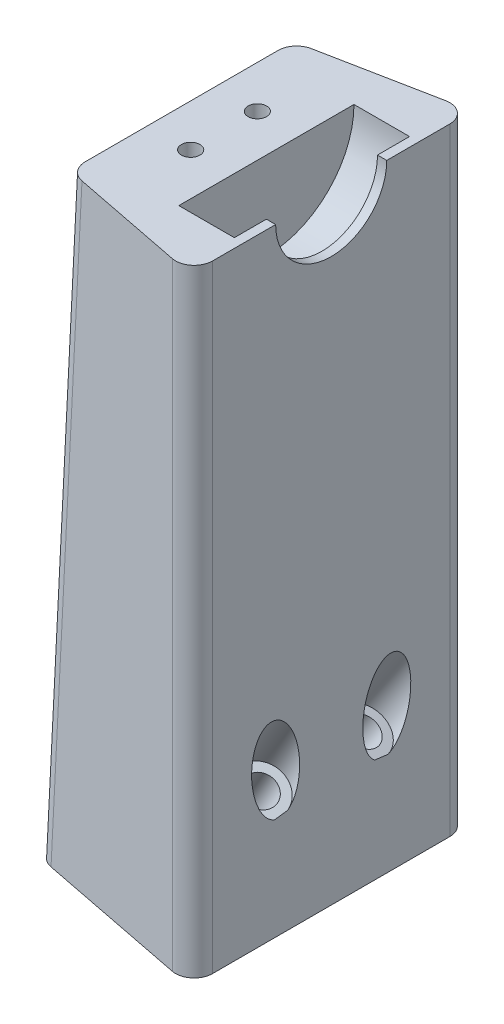
ISO-10303-21;
HEADER;
FILE_DESCRIPTION(('STEP AP214'),'2;1');
FILE_NAME('part.step','',(''),(''),'','','');
FILE_SCHEMA(('AUTOMOTIVE_DESIGN { 1 0 10303 214 1 1 1 1 }'));
ENDSEC;
DATA;
#1=APPLICATION_CONTEXT('core data for automotive mechanical design processes');
#2=APPLICATION_PROTOCOL_DEFINITION('international standard','automotive_design',2000,#1);
#3=PRODUCT_CONTEXT('',#1,'mechanical');
#4=PRODUCT('Part','Part','',(#3));
#5=PRODUCT_RELATED_PRODUCT_CATEGORY('part','',(#4));
#6=PRODUCT_DEFINITION_FORMATION('','',#4);
#7=PRODUCT_DEFINITION_CONTEXT('part definition',#1,'design');
#8=PRODUCT_DEFINITION('design','',#6,#7);
#9=PRODUCT_DEFINITION_SHAPE('','',#8);
#10=(LENGTH_UNIT() NAMED_UNIT(*) SI_UNIT(.MILLI.,.METRE.));
#11=(NAMED_UNIT(*) PLANE_ANGLE_UNIT() SI_UNIT($,.RADIAN.));
#12=(NAMED_UNIT(*) SI_UNIT($,.STERADIAN.) SOLID_ANGLE_UNIT());
#13=UNCERTAINTY_MEASURE_WITH_UNIT(LENGTH_MEASURE(1.E-05),#10,'distance_accuracy_value','');
#14=(GEOMETRIC_REPRESENTATION_CONTEXT(3) GLOBAL_UNCERTAINTY_ASSIGNED_CONTEXT((#13)) GLOBAL_UNIT_ASSIGNED_CONTEXT((#10,
#11,#12)) REPRESENTATION_CONTEXT('',''));
#15=CARTESIAN_POINT('',(0.,0.,0.));
#16=DIRECTION('',(0.,0.,1.));
#17=DIRECTION('',(1.,0.,0.));
#18=AXIS2_PLACEMENT_3D('',#15,#16,#17);
#19=CARTESIAN_POINT('',(0.,-36.55,0.));
#20=DIRECTION('',(0.,1.,0.));
#21=DIRECTION('',(0.,0.,1.));
#22=AXIS2_PLACEMENT_3D('',#19,#20,#21);
#23=PLANE('',#22);
#24=CARTESIAN_POINT('',(-28.9421875,-36.55,27.5));
#25=DIRECTION('',(0.,1.,0.));
#26=DIRECTION('',(0.,0.,1.));
#27=AXIS2_PLACEMENT_3D('',#24,#25,#26);
#28=CIRCLE('',#27,2.5);
#29=CARTESIAN_POINT('',(-28.9421875,-36.55,30.));
#30=VERTEX_POINT('',#29);
#31=EDGE_CURVE('E191',#30,#30,#28,.F.);
#32=ORIENTED_EDGE('',*,*,#31,.T.);
#33=EDGE_LOOP('',(#32));
#34=FACE_BOUND('',#33,.T.);
#35=DIRECTION('',(0.,0.,1.));
#36=VECTOR('',#35,1.);
#37=CARTESIAN_POINT('',(-2.5,-36.55,36.5));
#38=LINE('',#37,#36);
#39=CARTESIAN_POINT('',(-2.5,-36.55,12.85));
#40=VERTEX_POINT('',#39);
#41=CARTESIAN_POINT('',(-2.49999999999999,-36.55,21.5));
#42=VERTEX_POINT('',#41);
#43=EDGE_CURVE('E437',#40,#42,#38,.T.);
#44=ORIENTED_EDGE('',*,*,#43,.T.);
#45=DIRECTION('',(1.,0.,0.));
#46=VECTOR('',#45,1.);
#47=CARTESIAN_POINT('',(-84.3923015002474,-36.55,21.5));
#48=LINE('',#47,#46);
#49=CARTESIAN_POINT('',(0.,-36.55,21.5));
#50=VERTEX_POINT('',#49);
#51=EDGE_CURVE('E435',#42,#50,#48,.T.);
#52=ORIENTED_EDGE('',*,*,#51,.T.);
#53=DIRECTION('',(0.,0.,1.));
#54=VECTOR('',#53,1.);
#55=CARTESIAN_POINT('',(0.,-36.55,74.6));
#56=LINE('',#55,#54);
#57=CARTESIAN_POINT('',(0.,-36.55,4.48020643626594));
#58=VERTEX_POINT('',#57);
#59=EDGE_CURVE('E427',#58,#50,#56,.T.);
#60=ORIENTED_EDGE('',*,*,#59,.F.);
#61=CARTESIAN_POINT('',(-5.00000000000001,-36.55,4.48020643626594));
#62=DIRECTION('',(0.,1.,0.));
#63=DIRECTION('',(0.,0.,1.));
#64=AXIS2_PLACEMENT_3D('',#61,#62,#63);
#65=CIRCLE('',#64,5.);
#66=CARTESIAN_POINT('',(-5.96571895876474,-36.55,-0.425645874258924));
#67=VERTEX_POINT('',#66);
#68=EDGE_CURVE('E387',#67,#58,#65,.F.);
#69=ORIENTED_EDGE('',*,*,#68,.F.);
#70=DIRECTION('',(-0.981170462104977,0.,0.193143791752947));
#71=VECTOR('',#70,1.);
#72=CARTESIAN_POINT('',(0.,-36.55,-1.6));
#73=LINE('',#72,#71);
#74=CARTESIAN_POINT('',(-36.3403378519268,-36.55,5.55360981337135));
#75=VERTEX_POINT('',#74);
#76=EDGE_CURVE('E205',#67,#75,#73,.T.);
#77=ORIENTED_EDGE('',*,*,#76,.T.);
#78=CARTESIAN_POINT('',(-35.3746188931621,-36.55,10.4594621238962));
#79=DIRECTION('',(0.,1.,0.));
#80=DIRECTION('',(-0.981170462104977,0.,0.193143791752947));
#81=AXIS2_PLACEMENT_3D('',#78,#79,#80);
#82=ELLIPSE('',#81,5.01013377438725,5.);
#83=CARTESIAN_POINT('',(-40.384375,-36.55,10.46329937083));
#84=VERTEX_POINT('',#83);
#85=EDGE_CURVE('E417',#84,#75,#82,.F.);
#86=ORIENTED_EDGE('',*,*,#85,.F.);
#87=DIRECTION('',(0.,0.,-1.));
#88=VECTOR('',#87,1.);
#89=CARTESIAN_POINT('',(-40.384375,-36.55,-1.60000000000001));
#90=LINE('',#89,#88);
#91=CARTESIAN_POINT('',(-40.384375,-36.55,62.5367006291699));
#92=VERTEX_POINT('',#91);
#93=EDGE_CURVE('E430',#92,#84,#90,.T.);
#94=ORIENTED_EDGE('',*,*,#93,.F.);
#95=CARTESIAN_POINT('',(-35.3746188931621,-36.55,62.5405378761037));
#96=DIRECTION('',(0.,1.,0.));
#97=DIRECTION('',(0.981170462104977,0.,0.193143791752948));
#98=AXIS2_PLACEMENT_3D('',#95,#96,#97);
#99=ELLIPSE('',#98,5.01013377438725,5.);
#100=CARTESIAN_POINT('',(-36.3403378519268,-36.55,67.4463901866286));
#101=VERTEX_POINT('',#100);
#102=EDGE_CURVE('E185',#101,#92,#99,.F.);
#103=ORIENTED_EDGE('',*,*,#102,.F.);
#104=DIRECTION('',(0.981170462104977,0.,0.193143791752948));
#105=VECTOR('',#104,1.);
#106=CARTESIAN_POINT('',(0.,-36.55,74.6));
#107=LINE('',#106,#105);
#108=CARTESIAN_POINT('',(-5.96571895876474,-36.55,73.4256458742589));
#109=VERTEX_POINT('',#108);
#110=EDGE_CURVE('E202',#101,#109,#107,.T.);
#111=ORIENTED_EDGE('',*,*,#110,.T.);
#112=CARTESIAN_POINT('',(-5.,-36.55,68.519793563734));
#113=DIRECTION('',(0.,1.,0.));
#114=DIRECTION('',(0.,0.,1.));
#115=AXIS2_PLACEMENT_3D('',#112,#113,#114);
#116=CIRCLE('',#115,5.);
#117=CARTESIAN_POINT('',(0.,-36.55,68.519793563734));
#118=VERTEX_POINT('',#117);
#119=EDGE_CURVE('E422',#118,#109,#116,.F.);
#120=ORIENTED_EDGE('',*,*,#119,.F.);
#121=CARTESIAN_POINT('',(0.,-36.55,51.5));
#122=VERTEX_POINT('',#121);
#123=EDGE_CURVE('E186',#122,#118,#56,.T.);
#124=ORIENTED_EDGE('',*,*,#123,.F.);
#125=DIRECTION('',(1.,0.,0.));
#126=VECTOR('',#125,1.);
#127=CARTESIAN_POINT('',(-84.3923015002474,-36.55,51.5));
#128=LINE('',#127,#126);
#129=CARTESIAN_POINT('',(-2.49999999999999,-36.55,51.5));
#130=VERTEX_POINT('',#129);
#131=EDGE_CURVE('E432',#122,#130,#128,.F.);
#132=ORIENTED_EDGE('',*,*,#131,.T.);
#133=CARTESIAN_POINT('',(-2.49999999999999,-36.55,60.15));
#134=VERTEX_POINT('',#133);
#135=EDGE_CURVE('E193',#130,#134,#38,.T.);
#136=ORIENTED_EDGE('',*,*,#135,.T.);
#137=DIRECTION('',(1.,0.,0.));
#138=VECTOR('',#137,1.);
#139=CARTESIAN_POINT('',(-17.5,-36.55,60.15));
#140=LINE('',#139,#138);
#141=CARTESIAN_POINT('',(-17.5,-36.55,60.15));
#142=VERTEX_POINT('',#141);
#143=EDGE_CURVE('E184',#134,#142,#140,.F.);
#144=ORIENTED_EDGE('',*,*,#143,.T.);
#145=DIRECTION('',(0.,0.,1.));
#146=VECTOR('',#145,1.);
#147=CARTESIAN_POINT('',(-17.5,-36.55,36.5));
#148=LINE('',#147,#146);
#149=CARTESIAN_POINT('',(-17.5,-36.55,12.85));
#150=VERTEX_POINT('',#149);
#151=EDGE_CURVE('E170',#150,#142,#148,.T.);
#152=ORIENTED_EDGE('',*,*,#151,.F.);
#153=DIRECTION('',(1.,0.,0.));
#154=VECTOR('',#153,1.);
#155=CARTESIAN_POINT('',(-17.5,-36.55,12.85));
#156=LINE('',#155,#154);
#157=EDGE_CURVE('E182',#150,#40,#156,.T.);
#158=ORIENTED_EDGE('',*,*,#157,.T.);
#159=EDGE_LOOP('',(#44,#52,#60,#69,#77,#86,#94,#103,#111,#120,#124,#132,#136,#144,#152,#158));
#160=FACE_BOUND('',#159,.T.);
#161=CARTESIAN_POINT('',(-28.9421875,-36.55,45.5));
#162=DIRECTION('',(0.,1.,0.));
#163=DIRECTION('',(0.,0.,1.));
#164=AXIS2_PLACEMENT_3D('',#161,#162,#163);
#165=CIRCLE('',#164,2.5);
#166=CARTESIAN_POINT('',(-28.9421875,-36.55,48.));
#167=VERTEX_POINT('',#166);
#168=EDGE_CURVE('E196',#167,#167,#165,.F.);
#169=ORIENTED_EDGE('',*,*,#168,.T.);
#170=EDGE_LOOP('',(#169));
#171=FACE_BOUND('',#170,.T.);
#172=ADVANCED_FACE('F41',(#34,#160,#171),#23,.T.);
#173=CARTESIAN_POINT('',(-44.2606392973715,-173.209190251257,56.6));
#174=DIRECTION('',(-0.409473380250832,0.912322065317921,0.));
#175=DIRECTION('',(-0.912322065317922,-0.409473380250832,0.));
#176=AXIS2_PLACEMENT_3D('',#173,#174,#175);
#177=CYLINDRICAL_SURFACE('',#176,3.96875);
#178=CARTESIAN_POINT('',(-44.2606392973715,-173.209190251257,56.6));
#179=DIRECTION('',(-0.409473380250832,0.912322065317921,0.));
#180=DIRECTION('',(-0.912322065317922,-0.409473380250832,0.));
#181=AXIS2_PLACEMENT_3D('',#178,#179,#180);
#182=CIRCLE('',#181,3.96875);
#183=CARTESIAN_POINT('',(-47.881417494102,-174.834287729127,56.6));
#184=VERTEX_POINT('',#183);
#185=EDGE_CURVE('E488',#184,#184,#182,.T.);
#186=ORIENTED_EDGE('',*,*,#185,.T.);
#187=EDGE_LOOP('',(#186));
#188=FACE_BOUND('',#187,.T.);
#189=CARTESIAN_POINT('',(-30.8,-203.2,56.6));
#190=DIRECTION('',(0.,1.,0.));
#191=DIRECTION('',(-1.,0.,0.));
#192=AXIS2_PLACEMENT_3D('',#189,#190,#191);
#193=ELLIPSE('',#192,4.35016333690997,3.96875);
#194=CARTESIAN_POINT('',(-35.1501633369099,-203.2,56.6));
#195=VERTEX_POINT('',#194);
#196=EDGE_CURVE('E251',#195,#195,#193,.T.);
#197=ORIENTED_EDGE('',*,*,#196,.F.);
#198=EDGE_LOOP('',(#197));
#199=FACE_BOUND('',#198,.T.);
#200=ADVANCED_FACE('F283',(#188,#199),#177,.F.);
#201=CARTESIAN_POINT('',(-44.2606392973715,-173.209190251257,16.4));
#202=DIRECTION('',(-0.409473380250832,0.912322065317922,0.));
#203=DIRECTION('',(-0.912322065317922,-0.409473380250832,0.));
#204=AXIS2_PLACEMENT_3D('',#201,#202,#203);
#205=CYLINDRICAL_SURFACE('',#204,3.96875);
#206=CARTESIAN_POINT('',(-44.2606392973715,-173.209190251257,16.4));
#207=DIRECTION('',(-0.409473380250832,0.912322065317922,0.));
#208=DIRECTION('',(-0.912322065317922,-0.409473380250832,0.));
#209=AXIS2_PLACEMENT_3D('',#206,#207,#208);
#210=CIRCLE('',#209,3.96875);
#211=CARTESIAN_POINT('',(-47.881417494102,-174.834287729127,16.4));
#212=VERTEX_POINT('',#211);
#213=EDGE_CURVE('E479',#212,#212,#210,.T.);
#214=ORIENTED_EDGE('',*,*,#213,.T.);
#215=EDGE_LOOP('',(#214));
#216=FACE_BOUND('',#215,.T.);
#217=CARTESIAN_POINT('',(-30.8,-203.2,16.4));
#218=DIRECTION('',(0.,1.,0.));
#219=DIRECTION('',(-1.,0.,0.));
#220=AXIS2_PLACEMENT_3D('',#217,#218,#219);
#221=ELLIPSE('',#220,4.35016333690996,3.96875);
#222=CARTESIAN_POINT('',(-35.1501633369099,-203.2,16.4));
#223=VERTEX_POINT('',#222);
#224=EDGE_CURVE('E476',#223,#223,#221,.T.);
#225=ORIENTED_EDGE('',*,*,#224,.F.);
#226=EDGE_LOOP('',(#225));
#227=FACE_BOUND('',#226,.T.);
#228=ADVANCED_FACE('F285',(#216,#227),#205,.F.);
#229=CARTESIAN_POINT('',(-5.14806094619631,-172.140426092496,50.4404060441103));
#230=DIRECTION('',(0.535216311636663,0.837378683398453,0.111087534619869));
#231=DIRECTION('',(-0.842593811926632,0.538549596697414,0.));
#232=AXIS2_PLACEMENT_3D('',#229,#230,#231);
#233=CYLINDRICAL_SURFACE('',#232,3.96875000000001);
#234=CARTESIAN_POINT('',(-5.14806094619632,-172.140426092496,50.4404060441103));
#235=DIRECTION('',(0.535216311636663,0.837378683398453,0.111087534619869));
#236=DIRECTION('',(-0.842593811926632,0.538549596697414,0.));
#237=AXIS2_PLACEMENT_3D('',#234,#235,#236);
#238=CIRCLE('',#237,3.96875000000002);
#239=CARTESIAN_POINT('',(-8.49210513728016,-170.003057380604,50.4404060441103));
#240=VERTEX_POINT('',#239);
#241=EDGE_CURVE('E497',#240,#240,#238,.T.);
#242=ORIENTED_EDGE('',*,*,#241,.T.);
#243=EDGE_LOOP('',(#242));
#244=FACE_BOUND('',#243,.T.);
#245=CARTESIAN_POINT('',(-25.,-203.2,46.3200103854518));
#246=DIRECTION('',(0.,1.,0.));
#247=DIRECTION('',(0.979132052361167,0.,0.203225057606118));
#248=AXIS2_PLACEMENT_3D('',#245,#246,#247);
#249=ELLIPSE('',#248,4.73949251238766,3.96875000000001);
#250=CARTESIAN_POINT('',(-20.3594109691954,-203.2,47.2831940243055));
#251=VERTEX_POINT('',#250);
#252=EDGE_CURVE('E473',#251,#251,#249,.T.);
#253=ORIENTED_EDGE('',*,*,#252,.F.);
#254=EDGE_LOOP('',(#253));
#255=FACE_BOUND('',#254,.T.);
#256=ADVANCED_FACE('F529',(#244,#255),#233,.F.);
#257=CARTESIAN_POINT('',(-5.14806094619631,-172.140426092496,22.5595939558897));
#258=DIRECTION('',(-0.535216311636662,-0.837378683398453,0.11108753461987));
#259=DIRECTION('',(0.842593811926633,-0.538549596697414,0.));
#260=AXIS2_PLACEMENT_3D('',#257,#258,#259);
#261=CYLINDRICAL_SURFACE('',#260,3.96875000000001);
#262=CARTESIAN_POINT('',(-5.14806094619635,-172.140426092496,22.5595939558897));
#263=DIRECTION('',(-0.535216311636662,-0.837378683398453,0.11108753461987));
#264=DIRECTION('',(0.842593811926633,-0.538549596697414,0.));
#265=AXIS2_PLACEMENT_3D('',#262,#263,#264);
#266=CIRCLE('',#265,3.96875000000001);
#267=CARTESIAN_POINT('',(-1.80401675511252,-174.277794804389,22.5595939558897));
#268=VERTEX_POINT('',#267);
#269=EDGE_CURVE('E11',#268,#268,#266,.T.);
#270=ORIENTED_EDGE('',*,*,#269,.F.);
#271=EDGE_LOOP('',(#270));
#272=FACE_BOUND('',#271,.T.);
#273=CARTESIAN_POINT('',(-24.9999999999999,-203.2,26.6799896145482));
#274=DIRECTION('',(0.,1.,0.));
#275=DIRECTION('',(-0.979132052361167,0.,0.203225057606119));
#276=AXIS2_PLACEMENT_3D('',#273,#274,#275);
#277=ELLIPSE('',#276,4.73949251238766,3.96875000000001);
#278=CARTESIAN_POINT('',(-29.6405890308045,-203.2,27.643173253402));
#279=VERTEX_POINT('',#278);
#280=EDGE_CURVE('E502',#279,#279,#277,.F.);
#281=ORIENTED_EDGE('',*,*,#280,.T.);
#282=EDGE_LOOP('',(#281));
#283=FACE_BOUND('',#282,.T.);
#284=ADVANCED_FACE('F297',(#272,#283),#261,.F.);
#285=CARTESIAN_POINT('',(-44.2606392973716,-173.209190251257,0.));
#286=DIRECTION('',(-0.409473380250832,0.912322065317921,0.));
#287=DIRECTION('',(-0.912322065317922,-0.409473380250832,0.));
#288=AXIS2_PLACEMENT_3D('',#285,#286,#287);
#289=PLANE('',#288);
#290=ORIENTED_EDGE('',*,*,#185,.F.);
#291=EDGE_LOOP('',(#290));
#292=FACE_BOUND('',#291,.T.);
#293=CARTESIAN_POINT('',(-44.2606392973715,-173.209190251257,56.6));
#294=DIRECTION('',(-0.409473380250832,0.912322065317921,0.));
#295=DIRECTION('',(-0.912322065317922,-0.409473380250832,0.));
#296=AXIS2_PLACEMENT_3D('',#293,#294,#295);
#297=CIRCLE('',#296,6.34999999999999);
#298=CARTESIAN_POINT('',(-49.0602099890848,-175.363359825357,60.1561460348621));
#299=VERTEX_POINT('',#298);
#300=CARTESIAN_POINT('',(-49.0602099890848,-175.363359825357,53.043853965138));
#301=VERTEX_POINT('',#300);
#302=EDGE_CURVE('E480',#299,#301,#297,.T.);
#303=ORIENTED_EDGE('',*,*,#302,.T.);
#304=DIRECTION('',(0.,0.,-1.));
#305=VECTOR('',#304,1.);
#306=CARTESIAN_POINT('',(-49.0602099890848,-175.363359825357,-1.6));
#307=LINE('',#306,#305);
#308=EDGE_CURVE('E229',#299,#301,#307,.T.);
#309=ORIENTED_EDGE('',*,*,#308,.F.);
#310=EDGE_LOOP('',(#303,#309));
#311=FACE_BOUND('',#310,.T.);
#312=ADVANCED_FACE('F293',(#292,#311),#289,.T.);
#313=CARTESIAN_POINT('',(-44.2606392973715,-173.209190251257,16.4));
#314=DIRECTION('',(-0.409473380250832,0.912322065317922,0.));
#315=DIRECTION('',(-0.912322065317922,-0.409473380250832,0.));
#316=AXIS2_PLACEMENT_3D('',#313,#314,#315);
#317=PLANE('',#316);
#318=ORIENTED_EDGE('',*,*,#213,.F.);
#319=EDGE_LOOP('',(#318));
#320=FACE_BOUND('',#319,.T.);
#321=CARTESIAN_POINT('',(-44.2606392973715,-173.209190251257,16.4));
#322=DIRECTION('',(-0.409473380250832,0.912322065317922,0.));
#323=DIRECTION('',(-0.912322065317922,-0.409473380250832,0.));
#324=AXIS2_PLACEMENT_3D('',#321,#322,#323);
#325=CIRCLE('',#324,6.35);
#326=CARTESIAN_POINT('',(-49.0602099890848,-175.363359825357,19.9561460348621));
#327=VERTEX_POINT('',#326);
#328=CARTESIAN_POINT('',(-49.0602099890848,-175.363359825357,12.8438539651379));
#329=VERTEX_POINT('',#328);
#330=EDGE_CURVE('E466',#327,#329,#325,.T.);
#331=ORIENTED_EDGE('',*,*,#330,.T.);
#332=DIRECTION('',(0.,0.,-1.));
#333=VECTOR('',#332,1.);
#334=CARTESIAN_POINT('',(-49.0602099890848,-175.363359825357,-1.60000000000001));
#335=LINE('',#334,#333);
#336=EDGE_CURVE('E468',#327,#329,#335,.T.);
#337=ORIENTED_EDGE('',*,*,#336,.F.);
#338=EDGE_LOOP('',(#331,#337));
#339=FACE_BOUND('',#338,.T.);
#340=ADVANCED_FACE('F296',(#320,#339),#317,.T.);
#341=CARTESIAN_POINT('',(-1.16670078027396,-165.911344389661,-15.6965296935013));
#342=DIRECTION('',(0.535216311636663,0.837378683398453,0.111087534619869));
#343=DIRECTION('',(-0.842593811926632,0.538549596697414,0.));
#344=AXIS2_PLACEMENT_3D('',#341,#342,#343);
#345=PLANE('',#344);
#346=CARTESIAN_POINT('',(-5.14806094619632,-172.140426092496,50.4404060441103));
#347=DIRECTION('',(0.535216311636663,0.837378683398453,0.111087534619869));
#348=DIRECTION('',(-0.842593811926632,0.538549596697414,0.));
#349=AXIS2_PLACEMENT_3D('',#346,#347,#348);
#350=CIRCLE('',#349,6.35);
#351=CARTESIAN_POINT('',(0.,-175.139410754338,48.2435766259979));
#352=VERTEX_POINT('',#351);
#353=CARTESIAN_POINT('',(0.,-175.608465289815,51.7793132926179));
#354=VERTEX_POINT('',#353);
#355=EDGE_CURVE('E500',#352,#354,#350,.T.);
#356=ORIENTED_EDGE('',*,*,#355,.T.);
#357=DIRECTION('',(0.,-0.131508886766672,0.991314991665813));
#358=VECTOR('',#357,1.);
#359=CARTESIAN_POINT('',(0.,-179.060707820531,77.8023438246635));
#360=LINE('',#359,#358);
#361=EDGE_CURVE('E511',#352,#354,#360,.T.);
#362=ORIENTED_EDGE('',*,*,#361,.F.);
#363=EDGE_LOOP('',(#356,#362));
#364=FACE_BOUND('',#363,.T.);
#365=ORIENTED_EDGE('',*,*,#241,.F.);
#366=EDGE_LOOP('',(#365));
#367=FACE_BOUND('',#366,.T.);
#368=ADVANCED_FACE('F516',(#364,#367),#345,.T.);
#369=CARTESIAN_POINT('',(-5.14806094619631,-172.140426092496,50.4404060441103));
#370=DIRECTION('',(0.535216311636663,0.837378683398453,0.111087534619869));
#371=DIRECTION('',(-0.842593811926632,0.538549596697414,0.));
#372=AXIS2_PLACEMENT_3D('',#369,#370,#371);
#373=CYLINDRICAL_SURFACE('',#372,6.34999999999999);
#374=ORIENTED_EDGE('',*,*,#355,.F.);
#375=CARTESIAN_POINT('',(0.,-164.085969598077,51.508918692458));
#376=DIRECTION('',(1.,0.,0.));
#377=DIRECTION('',(0.,0.991314991665813,0.131508886766672));
#378=AXIS2_PLACEMENT_3D('',#375,#376,#377);
#379=ELLIPSE('',#378,11.8643618700298,6.34999999999999);
#380=EDGE_CURVE('E64',#354,#352,#379,.F.);
#381=ORIENTED_EDGE('',*,*,#380,.F.);
#382=EDGE_LOOP('',(#374,#381));
#383=FACE_BOUND('',#382,.T.);
#384=ADVANCED_FACE('F518',(#383),#373,.F.);
#385=CARTESIAN_POINT('',(-5.50697860028207,-172.701974733844,16.5973818389002));
#386=DIRECTION('',(-0.535216311636662,-0.837378683398453,0.11108753461987));
#387=DIRECTION('',(0.842593811926633,-0.538549596697414,0.));
#388=AXIS2_PLACEMENT_3D('',#385,#386,#387);
#389=PLANE('',#388);
#390=DIRECTION('',(0.,-0.131508886766672,-0.991314991665813));
#391=VECTOR('',#390,1.);
#392=CARTESIAN_POINT('',(0.,-169.126762919163,70.0798086231824));
#393=LINE('',#392,#391);
#394=CARTESIAN_POINT('',(0.,-175.139410754338,24.7564233740021));
#395=VERTEX_POINT('',#394);
#396=CARTESIAN_POINT('',(0.,-175.608465289815,21.2206867073821));
#397=VERTEX_POINT('',#396);
#398=EDGE_CURVE('E57',#395,#397,#393,.T.);
#399=ORIENTED_EDGE('',*,*,#398,.T.);
#400=CARTESIAN_POINT('',(-5.14806094619631,-172.140426092496,22.5595939558897));
#401=DIRECTION('',(-0.535216311636662,-0.837378683398453,0.11108753461987));
#402=DIRECTION('',(0.842593811926633,-0.538549596697414,0.));
#403=AXIS2_PLACEMENT_3D('',#400,#401,#402);
#404=CIRCLE('',#403,6.35);
#405=EDGE_CURVE('E50',#395,#397,#404,.T.);
#406=ORIENTED_EDGE('',*,*,#405,.F.);
#407=EDGE_LOOP('',(#399,#406));
#408=FACE_BOUND('',#407,.T.);
#409=ORIENTED_EDGE('',*,*,#269,.T.);
#410=EDGE_LOOP('',(#409));
#411=FACE_BOUND('',#410,.T.);
#412=ADVANCED_FACE('F358',(#408,#411),#389,.F.);
#413=CARTESIAN_POINT('',(-5.14806094619631,-172.140426092496,22.5595939558897));
#414=DIRECTION('',(-0.535216311636662,-0.837378683398453,0.11108753461987));
#415=DIRECTION('',(0.842593811926633,-0.538549596697414,0.));
#416=AXIS2_PLACEMENT_3D('',#413,#414,#415);
#417=CYLINDRICAL_SURFACE('',#416,6.35);
#418=CARTESIAN_POINT('',(0.,-164.085969598077,21.491081307542));
#419=DIRECTION('',(1.,0.,0.));
#420=DIRECTION('',(0.,-0.991314991665813,0.131508886766672));
#421=AXIS2_PLACEMENT_3D('',#418,#419,#420);
#422=ELLIPSE('',#421,11.8643618700298,6.35);
#423=EDGE_CURVE('E402',#397,#395,#422,.T.);
#424=ORIENTED_EDGE('',*,*,#423,.T.);
#425=ORIENTED_EDGE('',*,*,#405,.T.);
#426=EDGE_LOOP('',(#424,#425));
#427=FACE_BOUND('',#426,.T.);
#428=ADVANCED_FACE('F291',(#427),#417,.F.);
#429=CARTESIAN_POINT('',(-44.2606392973715,-173.209190251257,56.6));
#430=DIRECTION('',(-0.409473380250832,0.912322065317921,0.));
#431=DIRECTION('',(-0.912322065317922,-0.409473380250832,0.));
#432=AXIS2_PLACEMENT_3D('',#429,#430,#431);
#433=CYLINDRICAL_SURFACE('',#432,6.35000000000002);
#434=CARTESIAN_POINT('',(-48.3553730998798,-164.085969598077,56.6));
#435=DIRECTION('',(-0.998052578482889,0.0623782861551805,0.));
#436=DIRECTION('',(0.0623782861551805,0.998052578482889,0.));
#437=AXIS2_PLACEMENT_3D('',#434,#435,#436);
#438=ELLIPSE('',#437,13.6387540842283,6.35000000000002);
#439=CARTESIAN_POINT('',(-48.9883319539122,-174.213311262596,60.8430083154078));
#440=VERTEX_POINT('',#439);
#441=EDGE_CURVE('E482',#440,#299,#438,.F.);
#442=ORIENTED_EDGE('',*,*,#441,.F.);
#443=CARTESIAN_POINT('',(-48.9883319539122,-174.213311262596,60.8430083154077));
#444=CARTESIAN_POINT('',(-48.9765745794939,-174.025037745876,60.9408385533146));
#445=CARTESIAN_POINT('',(-48.9619787940512,-173.835515815802,61.0359163840341));
#446=CARTESIAN_POINT('',(-48.9281256768125,-173.453916347232,61.2198957058837));
#447=CARTESIAN_POINT('',(-48.9088685224761,-173.261838906289,61.3087974319742));
#448=CARTESIAN_POINT('',(-48.8667255499324,-172.875226461471,61.479684918247));
#449=CARTESIAN_POINT('',(-48.8438429581451,-172.680693782956,61.5616767293734));
#450=CARTESIAN_POINT('',(-48.7954669814079,-172.289060879072,61.7184065765262));
#451=CARTESIAN_POINT('',(-48.769973609256,-172.091960666293,61.7931446481065));
#452=CARTESIAN_POINT('',(-48.6915707168645,-171.500560926954,62.0047500267586));
#453=CARTESIAN_POINT('',(-48.6363096154903,-171.102572875923,62.1306043473968));
#454=CARTESIAN_POINT('',(-48.5262269829598,-170.298352106992,62.3526416971016));
#455=CARTESIAN_POINT('',(-48.4714055153856,-169.892118225503,62.4488205071252));
#456=CARTESIAN_POINT('',(-48.3786782556845,-169.16613662685,62.5948495770898));
#457=CARTESIAN_POINT('',(-48.3397517099901,-168.84761810118,62.6502584247074));
#458=CARTESIAN_POINT('',(-48.2661977413033,-168.207777917619,62.745836315437));
#459=CARTESIAN_POINT('',(-48.2315708774761,-167.886455900943,62.7860033777782));
#460=CARTESIAN_POINT('',(-48.1672579725733,-167.241723474399,62.8525172639089));
#461=CARTESIAN_POINT('',(-48.1375748273354,-166.918311954984,62.8788560069123));
#462=CARTESIAN_POINT('',(-48.0833190337591,-166.270310168835,62.9190248753643));
#463=CARTESIAN_POINT('',(-48.058746264833,-165.945719930099,62.9328552959932));
#464=CARTESIAN_POINT('',(-48.0143538138983,-165.293600942422,62.9492327743458));
#465=CARTESIAN_POINT('',(-47.9945695346392,-164.966067831354,62.9516980847429));
#466=CARTESIAN_POINT('',(-47.9595556222521,-164.310858252034,62.9460750253161));
#467=CARTESIAN_POINT('',(-47.9443260146847,-163.983181782989,62.9379865962665));
#468=CARTESIAN_POINT('',(-47.9178580819908,-163.328012984596,62.9119438860946));
#469=CARTESIAN_POINT('',(-47.9066204234496,-163.00052069511,62.8939879585471));
#470=CARTESIAN_POINT('',(-47.8875028573339,-162.346094085038,62.8486334289382));
#471=CARTESIAN_POINT('',(-47.8796229776984,-162.019159769117,62.82123474831));
#472=CARTESIAN_POINT('',(-47.8668312955018,-161.380845811031,62.7585894306473));
#473=CARTESIAN_POINT('',(-47.8618018850573,-161.069428257728,62.7237514393269));
#474=CARTESIAN_POINT('',(-47.8535494786795,-160.447663997551,62.6454950490212));
#475=CARTESIAN_POINT('',(-47.8503263870321,-160.137317234805,62.6020771048389));
#476=CARTESIAN_POINT('',(-47.8450080055764,-159.518345998818,62.5063397464604));
#477=CARTESIAN_POINT('',(-47.8429114425895,-159.209719973052,62.4540304694822));
#478=CARTESIAN_POINT('',(-47.839080369521,-158.594186727843,62.3397722623363));
#479=CARTESIAN_POINT('',(-47.8373459237866,-158.287279823296,62.2778216223351));
#480=CARTESIAN_POINT('',(-47.833361540061,-157.679959712077,62.1440733330196));
#481=CARTESIAN_POINT('',(-47.8311188867835,-157.37951480453,62.0724201027499));
#482=CARTESIAN_POINT('',(-47.8250079695715,-156.781885172855,61.9170248060973));
#483=CARTESIAN_POINT('',(-47.8211405006766,-156.484698927106,61.8332886651503));
#484=CARTESIAN_POINT('',(-47.8129416893848,-156.041872921523,61.6964863415271));
#485=CARTESIAN_POINT('',(-47.8098016526862,-155.894504855921,61.6489274578231));
#486=CARTESIAN_POINT('',(-47.8024422796146,-155.601231482098,61.5496192409258));
#487=CARTESIAN_POINT('',(-47.7982230994644,-155.455325965325,61.4978705150182));
#488=CARTESIAN_POINT('',(-47.78836764545,-155.16509735523,61.3895094555917));
#489=CARTESIAN_POINT('',(-47.7827291217377,-155.020777157525,61.3328894952065));
#490=CARTESIAN_POINT('',(-47.7695462488588,-154.734505949413,61.2139762132299));
#491=CARTESIAN_POINT('',(-47.7620009525763,-154.592556153878,61.1516800820812));
#492=CARTESIAN_POINT('',(-47.7532586677315,-154.452138683703,61.0861329780418));
#493=B_SPLINE_CURVE_WITH_KNOTS('',3,(#443,#444,#445,#446,#447,#448,#449,#450,#451,#452,#453,
#454,#455,#456,#457,#458,#459,#460,#461,#462,#463,#464,#465,#466,#467,#468,#469,#470,#471,#472,
#473,#474,#475,#476,#477,#478,#479,#480,#481,#482,#483,#484,#485,#486,#487,#488,#489,#490,#491,
#492),.UNSPECIFIED.,.F.,.F.,(4,2,2,2,2,2,2,2,2,2,2,2,2,2,2,2,2,2,2,2,2,2,2,2,4),(0.,
0.637452339685207,1.27488041518833,1.91174437209209,2.54860520725564,3.81050345466441,
5.07258102678257,6.0490882059615,7.02572224527523,8.00292636191736,8.98010741719897,
9.96430631667133,10.9485107393251,11.9328794296589,12.9172563104554,13.8573357212314,
14.7973653139815,15.7363302587473,16.675461913034,17.6018994826751,18.5278842635033,
18.9924821736637,19.4570128640412,19.9222845858977,20.3877878693779),.UNSPECIFIED.);
#494=CARTESIAN_POINT('',(-47.7532586677314,-154.452138683703,61.0861329780417));
#495=VERTEX_POINT('',#494);
#496=EDGE_CURVE('E237',#440,#495,#493,.T.);
#497=ORIENTED_EDGE('',*,*,#496,.T.);
#498=EDGE_CURVE('E470',#301,#495,#438,.F.);
#499=ORIENTED_EDGE('',*,*,#498,.F.);
#500=ORIENTED_EDGE('',*,*,#302,.F.);
#501=EDGE_LOOP('',(#442,#497,#499,#500));
#502=FACE_BOUND('',#501,.T.);
#503=ADVANCED_FACE('F287',(#502),#433,.F.);
#504=CARTESIAN_POINT('',(-44.2606392973715,-173.209190251257,16.4));
#505=DIRECTION('',(-0.409473380250832,0.912322065317922,0.));
#506=DIRECTION('',(-0.912322065317922,-0.409473380250832,0.));
#507=AXIS2_PLACEMENT_3D('',#504,#505,#506);
#508=CYLINDRICAL_SURFACE('',#507,6.35000000000001);
#509=CARTESIAN_POINT('',(-48.3553730998798,-164.085969598077,16.4));
#510=DIRECTION('',(-0.998052578482889,0.0623782861551805,0.));
#511=DIRECTION('',(0.0623782861551805,0.998052578482889,0.));
#512=AXIS2_PLACEMENT_3D('',#509,#510,#511);
#513=ELLIPSE('',#512,13.6387540842283,6.35000000000001);
#514=CARTESIAN_POINT('',(-47.7532586677314,-154.452138683703,11.9138670219582));
#515=VERTEX_POINT('',#514);
#516=EDGE_CURVE('E465',#515,#327,#513,.F.);
#517=ORIENTED_EDGE('',*,*,#516,.F.);
#518=CARTESIAN_POINT('',(-47.7532586677314,-154.452138683703,11.9138670219582));
#519=CARTESIAN_POINT('',(-47.7604266683513,-154.567088514686,11.8601835616224));
#520=CARTESIAN_POINT('',(-47.7667803593101,-154.683086068821,11.8086986167153));
#521=CARTESIAN_POINT('',(-47.7781454013654,-154.916764380567,11.709642377684));
#522=CARTESIAN_POINT('',(-47.7831571921954,-155.034444573438,11.6620698050456));
#523=CARTESIAN_POINT('',(-47.7921237481778,-155.27101225457,11.5703744640016));
#524=CARTESIAN_POINT('',(-47.7960797530072,-155.389898155266,11.5262476930946));
#525=CARTESIAN_POINT('',(-47.8031492188027,-155.628780999085,11.4410148849172));
#526=CARTESIAN_POINT('',(-47.8062625996331,-155.748778046758,11.399909135225));
#527=CARTESIAN_POINT('',(-47.8145866406677,-156.109351382053,11.2809154469236));
#528=CARTESIAN_POINT('',(-47.8188080262393,-156.351284353022,11.2070562336762));
#529=CARTESIAN_POINT('',(-47.8256373392074,-156.83779120611,11.0683131992962));
#530=CARTESIAN_POINT('',(-47.8282446802328,-157.082366015198,11.0034326466864));
#531=CARTESIAN_POINT('',(-47.8326139997225,-157.577001597941,10.8805901290505));
#532=CARTESIAN_POINT('',(-47.834363213339,-157.827090567457,10.8227417320132));
#533=CARTESIAN_POINT('',(-47.8375639566371,-158.328772149423,10.7141963149053));
#534=CARTESIAN_POINT('',(-47.8390155272081,-158.580364550443,10.6634983128315));
#535=CARTESIAN_POINT('',(-47.842119552122,-159.085069548883,10.5685727143729));
#536=CARTESIAN_POINT('',(-47.8437722413044,-159.338183588964,10.5243528175789));
#537=CARTESIAN_POINT('',(-47.8477079843692,-159.845412953985,10.4420364922089));
#538=CARTESIAN_POINT('',(-47.8499910826535,-160.099528348211,10.4039404952589));
#539=CARTESIAN_POINT('',(-47.8572538857607,-160.761185771912,10.3125086919212));
#540=CARTESIAN_POINT('',(-47.8630296545025,-161.169357313314,10.2637324796208));
#541=CARTESIAN_POINT('',(-47.8786518299703,-161.987117912165,10.1807285893329));
#542=CARTESIAN_POINT('',(-47.8884984760782,-162.396707051568,10.1465017671409));
#543=CARTESIAN_POINT('',(-47.9136087900318,-163.216823469934,10.0929059280911));
#544=CARTESIAN_POINT('',(-47.9288740022195,-163.627350983165,10.073541152036));
#545=CARTESIAN_POINT('',(-47.966044853152,-164.448556634215,10.050657483719));
#546=CARTESIAN_POINT('',(-47.9879502832028,-164.859234766895,10.0471380935109));
#547=CARTESIAN_POINT('',(-48.0391873174977,-165.676651276077,10.0575297542861));
#548=CARTESIAN_POINT('',(-48.0684583413682,-166.083394965016,10.0713021030401));
#549=CARTESIAN_POINT('',(-48.1350297020615,-166.895171156014,10.1182354980948));
#550=CARTESIAN_POINT('',(-48.172330494185,-167.300203559712,10.1513976440109));
#551=CARTESIAN_POINT('',(-48.2545962312059,-168.106492318303,10.2396919233352));
#552=CARTESIAN_POINT('',(-48.2995494437978,-168.507753475894,10.2947905953546));
#553=CARTESIAN_POINT('',(-48.3955905844322,-169.305308798112,10.4297292639694));
#554=CARTESIAN_POINT('',(-48.44667655315,-169.701604504677,10.5095613714154));
#555=CARTESIAN_POINT('',(-48.5229289490592,-170.272418945497,10.645144534073));
#556=CARTESIAN_POINT('',(-48.5469881521413,-170.449675630748,10.6901817950344));
#557=CARTESIAN_POINT('',(-48.595220489192,-170.802625328715,10.7859039343237));
#558=CARTESIAN_POINT('',(-48.6193936147714,-170.978318453901,10.8365884028317));
#559=CARTESIAN_POINT('',(-48.6913508631949,-171.50284033453,10.997258784078));
#560=CARTESIAN_POINT('',(-48.7385803537391,-171.849165613733,11.1158744202068));
#561=CARTESIAN_POINT('',(-48.8048180000497,-172.363973432938,11.3110272786979));
#562=CARTESIAN_POINT('',(-48.8261948315347,-172.535376410189,11.3792139197778));
#563=CARTESIAN_POINT('',(-48.8666561788924,-172.876203106994,11.5210247057054));
#564=CARTESIAN_POINT('',(-48.8857406964565,-173.045626828008,11.5946488465407));
#565=CARTESIAN_POINT('',(-48.9209353221268,-173.38255996387,11.7470486079828));
#566=CARTESIAN_POINT('',(-48.9370438578529,-173.550068323129,11.8258269222363));
#567=CARTESIAN_POINT('',(-48.9656012314376,-173.883137866904,11.9880364491209));
#568=CARTESIAN_POINT('',(-48.9780499763776,-174.04869900188,12.0714677798236));
#569=CARTESIAN_POINT('',(-48.9883319539122,-174.213311262596,12.1569916845922));
#570=B_SPLINE_CURVE_WITH_KNOTS('',3,(#518,#519,#520,#521,#522,#523,#524,#525,#526,#527,#528,
#529,#530,#531,#532,#533,#534,#535,#536,#537,#538,#539,#540,#541,#542,#543,#544,#545,#546,#547,
#548,#549,#550,#551,#552,#553,#554,#555,#556,#557,#558,#559,#560,#561,#562,#563,#564,#565,#566,
#567,#568,#569),.UNSPECIFIED.,.F.,.F.,(4,2,2,2,2,2,2,2,2,2,2,2,2,2,2,2,2,2,2,2,2,2,2,2,2,4),(0.,
0.3811445651718,0.762164078002102,1.14273421926268,1.52334054111455,2.28206837829429,
3.04107169443728,3.8110466802772,4.58091581800245,5.35169269102679,6.12252386630889,
7.35557338804097,8.58869542774791,9.82216920133605,11.0556042123624,12.2792083794882,
13.5028819452089,14.7246960599228,15.9461208568041,16.4994331488352,17.0527053128929,
18.1590819222729,18.7161088415386,19.273135349773,19.8304553302311,20.387789459287),.UNSPECIFIED.);
#571=CARTESIAN_POINT('',(-48.9883319539122,-174.213311262596,12.1569916845922));
#572=VERTEX_POINT('',#571);
#573=EDGE_CURVE('E305',#515,#572,#570,.T.);
#574=ORIENTED_EDGE('',*,*,#573,.T.);
#575=EDGE_CURVE('E462',#329,#572,#513,.F.);
#576=ORIENTED_EDGE('',*,*,#575,.F.);
#577=ORIENTED_EDGE('',*,*,#330,.F.);
#578=EDGE_LOOP('',(#517,#574,#576,#577));
#579=FACE_BOUND('',#578,.T.);
#580=ADVANCED_FACE('F272',(#579),#508,.F.);
#581=CARTESIAN_POINT('',(0.,-203.2,0.));
#582=DIRECTION('',(0.,1.,0.));
#583=DIRECTION('',(0.,0.,1.));
#584=AXIS2_PLACEMENT_3D('',#581,#582,#583);
#585=PLANE('',#584);
#586=ORIENTED_EDGE('',*,*,#280,.F.);
#587=EDGE_LOOP('',(#586));
#588=FACE_BOUND('',#587,.T.);
#589=ORIENTED_EDGE('',*,*,#252,.T.);
#590=EDGE_LOOP('',(#589));
#591=FACE_BOUND('',#590,.T.);
#592=ORIENTED_EDGE('',*,*,#224,.T.);
#593=EDGE_LOOP('',(#592));
#594=FACE_BOUND('',#593,.T.);
#595=ORIENTED_EDGE('',*,*,#196,.T.);
#596=EDGE_LOOP('',(#595));
#597=FACE_BOUND('',#596,.T.);
#598=DIRECTION('',(0.,0.,1.));
#599=VECTOR('',#598,1.);
#600=CARTESIAN_POINT('',(-50.8,-203.2,-1.6));
#601=LINE('',#600,#599);
#602=CARTESIAN_POINT('',(-50.8,-203.2,12.5136192527197));
#603=VERTEX_POINT('',#602);
#604=CARTESIAN_POINT('',(-50.8,-203.2,60.4863807472802));
#605=VERTEX_POINT('',#604);
#606=EDGE_CURVE('E175',#603,#605,#601,.T.);
#607=ORIENTED_EDGE('',*,*,#606,.F.);
#608=CARTESIAN_POINT('',(-45.7902438931621,-203.2,12.509782005786));
#609=DIRECTION('',(0.,1.,0.));
#610=DIRECTION('',(-0.981170462104977,0.,0.193143791752947));
#611=AXIS2_PLACEMENT_3D('',#608,#609,#610);
#612=ELLIPSE('',#611,5.01013377438725,5.);
#613=CARTESIAN_POINT('',(-46.7559628519268,-203.2,7.6039296952611));
#614=VERTEX_POINT('',#613);
#615=EDGE_CURVE('E214',#603,#614,#612,.F.);
#616=ORIENTED_EDGE('',*,*,#615,.T.);
#617=DIRECTION('',(0.981170462104977,0.,-0.193143791752947));
#618=VECTOR('',#617,1.);
#619=CARTESIAN_POINT('',(-0.303211173451115,-203.2,-1.54031276113168));
#620=LINE('',#619,#618);
#621=CARTESIAN_POINT('',(-5.96571895876474,-203.2,-0.425645874258926));
#622=VERTEX_POINT('',#621);
#623=EDGE_CURVE('E226',#614,#622,#620,.T.);
#624=ORIENTED_EDGE('',*,*,#623,.T.);
#625=CARTESIAN_POINT('',(-5.00000000000001,-203.2,4.48020643626594));
#626=DIRECTION('',(0.,1.,0.));
#627=DIRECTION('',(0.,0.,1.));
#628=AXIS2_PLACEMENT_3D('',#625,#626,#627);
#629=CIRCLE('',#628,5.);
#630=CARTESIAN_POINT('',(0.,-203.2,4.48020643626594));
#631=VERTEX_POINT('',#630);
#632=EDGE_CURVE('E314',#622,#631,#629,.F.);
#633=ORIENTED_EDGE('',*,*,#632,.T.);
#634=DIRECTION('',(0.,0.,-1.));
#635=VECTOR('',#634,1.);
#636=CARTESIAN_POINT('',(0.,-203.2,-1.6));
#637=LINE('',#636,#635);
#638=CARTESIAN_POINT('',(0.,-203.2,68.519793563734));
#639=VERTEX_POINT('',#638);
#640=EDGE_CURVE('E232',#639,#631,#637,.T.);
#641=ORIENTED_EDGE('',*,*,#640,.F.);
#642=CARTESIAN_POINT('',(-4.99999999999999,-203.2,68.519793563734));
#643=DIRECTION('',(0.,1.,0.));
#644=DIRECTION('',(0.,0.,1.));
#645=AXIS2_PLACEMENT_3D('',#642,#643,#644);
#646=CIRCLE('',#645,5.);
#647=CARTESIAN_POINT('',(-5.96571895876473,-203.2,73.4256458742589));
#648=VERTEX_POINT('',#647);
#649=EDGE_CURVE('E394',#639,#648,#646,.F.);
#650=ORIENTED_EDGE('',*,*,#649,.T.);
#651=DIRECTION('',(-0.981170462104977,0.,-0.193143791752948));
#652=VECTOR('',#651,1.);
#653=CARTESIAN_POINT('',(-14.1372209621583,-203.2,71.8170824877641));
#654=LINE('',#653,#652);
#655=CARTESIAN_POINT('',(-46.7559628519268,-203.2,65.3960703047388));
#656=VERTEX_POINT('',#655);
#657=EDGE_CURVE('E399',#648,#656,#654,.T.);
#658=ORIENTED_EDGE('',*,*,#657,.T.);
#659=CARTESIAN_POINT('',(-45.7902438931621,-203.2,60.4902179942139));
#660=DIRECTION('',(0.,1.,0.));
#661=DIRECTION('',(0.981170462104977,0.,0.193143791752948));
#662=AXIS2_PLACEMENT_3D('',#659,#660,#661);
#663=ELLIPSE('',#662,5.01013377438725,5.);
#664=EDGE_CURVE('E392',#656,#605,#663,.F.);
#665=ORIENTED_EDGE('',*,*,#664,.T.);
#666=EDGE_LOOP('',(#607,#616,#624,#633,#641,#650,#658,#665));
#667=FACE_BOUND('',#666,.T.);
#668=ADVANCED_FACE('F262',(#588,#591,#594,#597,#667),#585,.F.);
#669=CARTESIAN_POINT('',(0.,-203.2001,74.6));
#670=DIRECTION('',(0.193143791752948,0.,-0.981170462104977));
#671=DIRECTION('',(-0.981170462104977,0.,-0.193143791752948));
#672=AXIS2_PLACEMENT_3D('',#669,#670,#671);
#673=PLANE('',#672);
#674=ORIENTED_EDGE('',*,*,#110,.F.);
#675=DIRECTION('',(-0.0623735840343343,-0.997977344549349,-0.0122782645736878));
#676=VECTOR('',#675,1.);
#677=CARTESIAN_POINT('',(-46.772305694785,-203.461485485731,65.392853209688));
#678=LINE('',#677,#676);
#679=EDGE_CURVE('E211',#101,#656,#678,.T.);
#680=ORIENTED_EDGE('',*,*,#679,.T.);
#681=ORIENTED_EDGE('',*,*,#657,.F.);
#682=DIRECTION('',(0.,1.,0.));
#683=VECTOR('',#682,1.);
#684=CARTESIAN_POINT('',(-5.96571895876474,-20.,73.4256458742589));
#685=LINE('',#684,#683);
#686=EDGE_CURVE('E208',#648,#109,#685,.T.);
#687=ORIENTED_EDGE('',*,*,#686,.T.);
#688=EDGE_LOOP('',(#674,#680,#681,#687));
#689=FACE_BOUND('',#688,.T.);
#690=ADVANCED_FACE('F271',(#689),#673,.F.);
#691=CARTESIAN_POINT('',(0.,-203.2,74.6));
#692=DIRECTION('',(1.,0.,0.));
#693=DIRECTION('',(0.,0.,-1.));
#694=AXIS2_PLACEMENT_3D('',#691,#692,#693);
#695=PLANE('',#694);
#696=ORIENTED_EDGE('',*,*,#423,.F.);
#697=ORIENTED_EDGE('',*,*,#398,.F.);
#698=EDGE_LOOP('',(#696,#697));
#699=FACE_BOUND('',#698,.T.);
#700=ORIENTED_EDGE('',*,*,#380,.T.);
#701=ORIENTED_EDGE('',*,*,#361,.T.);
#702=EDGE_LOOP('',(#700,#701));
#703=FACE_BOUND('',#702,.T.);
#704=DIRECTION('',(0.,1.,0.));
#705=VECTOR('',#704,1.);
#706=CARTESIAN_POINT('',(0.,-20.,4.48020643626594));
#707=LINE('',#706,#705);
#708=EDGE_CURVE('E212',#631,#58,#707,.T.);
#709=ORIENTED_EDGE('',*,*,#708,.T.);
#710=ORIENTED_EDGE('',*,*,#59,.T.);
#711=CARTESIAN_POINT('',(0.,-36.55,36.5));
#712=DIRECTION('',(1.,0.,0.));
#713=DIRECTION('',(0.,0.,-1.));
#714=AXIS2_PLACEMENT_3D('',#711,#712,#713);
#715=CIRCLE('',#714,15.);
#716=EDGE_CURVE('E227',#122,#50,#715,.T.);
#717=ORIENTED_EDGE('',*,*,#716,.F.);
#718=ORIENTED_EDGE('',*,*,#123,.T.);
#719=DIRECTION('',(0.,1.,0.));
#720=VECTOR('',#719,1.);
#721=CARTESIAN_POINT('',(0.,-203.199999999683,68.519793563734));
#722=LINE('',#721,#720);
#723=EDGE_CURVE('E235',#118,#639,#722,.F.);
#724=ORIENTED_EDGE('',*,*,#723,.T.);
#725=ORIENTED_EDGE('',*,*,#640,.T.);
#726=EDGE_LOOP('',(#709,#710,#717,#718,#724,#725));
#727=FACE_BOUND('',#726,.T.);
#728=ADVANCED_FACE('F364',(#699,#703,#727),#695,.T.);
#729=CARTESIAN_POINT('',(-4.99999999999999,-203.2001,68.519793563734));
#730=DIRECTION('',(0.,-1.,0.));
#731=DIRECTION('',(1.,0.,0.));
#732=AXIS2_PLACEMENT_3D('',#729,#730,#731);
#733=CYLINDRICAL_SURFACE('',#732,5.);
#734=ORIENTED_EDGE('',*,*,#723,.F.);
#735=ORIENTED_EDGE('',*,*,#119,.T.);
#736=ORIENTED_EDGE('',*,*,#686,.F.);
#737=ORIENTED_EDGE('',*,*,#649,.F.);
#738=EDGE_LOOP('',(#734,#735,#736,#737));
#739=FACE_BOUND('',#738,.T.);
#740=ADVANCED_FACE('F369',(#739),#733,.T.);
#741=CARTESIAN_POINT('',(0.,-203.2001,-1.6));
#742=DIRECTION('',(0.193143791752947,0.,0.981170462104977));
#743=DIRECTION('',(0.981170462104977,0.,-0.193143791752947));
#744=AXIS2_PLACEMENT_3D('',#741,#742,#743);
#745=PLANE('',#744);
#746=ORIENTED_EDGE('',*,*,#76,.F.);
#747=DIRECTION('',(0.,1.,0.));
#748=VECTOR('',#747,1.);
#749=CARTESIAN_POINT('',(-5.96571895876473,-203.199999999683,-0.425645874258926));
#750=LINE('',#749,#748);
#751=EDGE_CURVE('E224',#67,#622,#750,.F.);
#752=ORIENTED_EDGE('',*,*,#751,.T.);
#753=ORIENTED_EDGE('',*,*,#623,.F.);
#754=DIRECTION('',(0.0623735840343343,0.997977344549349,-0.0122782645736878));
#755=VECTOR('',#754,1.);
#756=CARTESIAN_POINT('',(-35.322305694785,-20.2614854857306,5.35320978243792));
#757=LINE('',#756,#755);
#758=EDGE_CURVE('E221',#614,#75,#757,.T.);
#759=ORIENTED_EDGE('',*,*,#758,.T.);
#760=EDGE_LOOP('',(#746,#752,#753,#759));
#761=FACE_BOUND('',#760,.T.);
#762=ADVANCED_FACE('F372',(#761),#745,.F.);
#763=CARTESIAN_POINT('',(-5.00000000000001,-203.2,4.48020643626594));
#764=DIRECTION('',(0.,-1.,0.));
#765=DIRECTION('',(1.,0.,0.));
#766=AXIS2_PLACEMENT_3D('',#763,#764,#765);
#767=CYLINDRICAL_SURFACE('',#766,5.);
#768=ORIENTED_EDGE('',*,*,#751,.F.);
#769=ORIENTED_EDGE('',*,*,#68,.T.);
#770=ORIENTED_EDGE('',*,*,#708,.F.);
#771=ORIENTED_EDGE('',*,*,#632,.F.);
#772=EDGE_LOOP('',(#768,#769,#770,#771));
#773=FACE_BOUND('',#772,.T.);
#774=ADVANCED_FACE('F323',(#773),#767,.T.);
#775=CARTESIAN_POINT('',(-50.8,-203.2,-1.6));
#776=DIRECTION('',(-0.998052578482889,0.0623782861551805,0.));
#777=DIRECTION('',(0.,0.,1.));
#778=AXIS2_PLACEMENT_3D('',#775,#776,#777);
#779=PLANE('',#778);
#780=DIRECTION('',(-0.0623735840343343,-0.997977344549349,-0.0122782645736878));
#781=VECTOR('',#780,1.);
#782=CARTESIAN_POINT('',(-39.3468496284347,-19.9495940549547,62.7409379070372));
#783=LINE('',#782,#781);
#784=EDGE_CURVE('E217',#495,#92,#783,.F.);
#785=ORIENTED_EDGE('',*,*,#784,.T.);
#786=ORIENTED_EDGE('',*,*,#93,.T.);
#787=DIRECTION('',(0.0623735840343343,0.997977344549349,-0.0122782645736878));
#788=VECTOR('',#787,1.);
#789=CARTESIAN_POINT('',(-50.7968496284347,-203.149594054955,12.5129991008368));
#790=LINE('',#789,#788);
#791=EDGE_CURVE('E215',#84,#515,#790,.F.);
#792=ORIENTED_EDGE('',*,*,#791,.T.);
#793=ORIENTED_EDGE('',*,*,#516,.T.);
#794=ORIENTED_EDGE('',*,*,#336,.T.);
#795=ORIENTED_EDGE('',*,*,#575,.T.);
#796=DIRECTION('',(0.0623735840343343,0.997977344549349,-0.0122782645736878));
#797=VECTOR('',#796,1.);
#798=CARTESIAN_POINT('',(-50.7968496284347,-203.149594054955,12.5129991008368));
#799=LINE('',#798,#797);
#800=EDGE_CURVE('E313',#572,#603,#799,.F.);
#801=ORIENTED_EDGE('',*,*,#800,.T.);
#802=ORIENTED_EDGE('',*,*,#606,.T.);
#803=DIRECTION('',(-0.0623735840343343,-0.997977344549349,-0.0122782645736878));
#804=VECTOR('',#803,1.);
#805=CARTESIAN_POINT('',(-39.3468496284347,-19.9495940549547,62.7409379070372));
#806=LINE('',#805,#804);
#807=EDGE_CURVE('E218',#605,#440,#806,.F.);
#808=ORIENTED_EDGE('',*,*,#807,.T.);
#809=ORIENTED_EDGE('',*,*,#441,.T.);
#810=ORIENTED_EDGE('',*,*,#308,.T.);
#811=ORIENTED_EDGE('',*,*,#498,.T.);
#812=EDGE_LOOP('',(#785,#786,#792,#793,#794,#795,#801,#802,#808,#809,#810,#811));
#813=FACE_BOUND('',#812,.T.);
#814=ADVANCED_FACE('F321',(#813),#779,.T.);
#815=CARTESIAN_POINT('',(-45.6012989966381,-200.176881655617,12.4725881285175));
#816=DIRECTION('',(-0.0623735840343343,-0.997977344549349,0.0122782645736878));
#817=DIRECTION('',(0.998052578482889,-0.0623782861551805,0.));
#818=AXIS2_PLACEMENT_3D('',#815,#816,#817);
#819=CYLINDRICAL_SURFACE('',#818,5.);
#820=ORIENTED_EDGE('',*,*,#791,.F.);
#821=ORIENTED_EDGE('',*,*,#85,.T.);
#822=ORIENTED_EDGE('',*,*,#758,.F.);
#823=ORIENTED_EDGE('',*,*,#615,.F.);
#824=ORIENTED_EDGE('',*,*,#800,.F.);
#825=ORIENTED_EDGE('',*,*,#573,.F.);
#826=EDGE_LOOP('',(#820,#821,#822,#823,#824,#825));
#827=FACE_BOUND('',#826,.T.);
#828=ADVANCED_FACE('F316',(#827),#819,.T.);
#829=CARTESIAN_POINT('',(-45.6012989966381,-200.176881655617,60.5274118714824));
#830=DIRECTION('',(0.0623735840343343,0.997977344549349,0.0122782645736878));
#831=DIRECTION('',(-0.998052578482889,0.0623782861551805,0.));
#832=AXIS2_PLACEMENT_3D('',#829,#830,#831);
#833=CYLINDRICAL_SURFACE('',#832,5.);
#834=ORIENTED_EDGE('',*,*,#679,.F.);
#835=ORIENTED_EDGE('',*,*,#102,.T.);
#836=ORIENTED_EDGE('',*,*,#784,.F.);
#837=ORIENTED_EDGE('',*,*,#496,.F.);
#838=ORIENTED_EDGE('',*,*,#807,.F.);
#839=ORIENTED_EDGE('',*,*,#664,.F.);
#840=EDGE_LOOP('',(#834,#835,#836,#837,#838,#839));
#841=FACE_BOUND('',#840,.T.);
#842=ADVANCED_FACE('F320',(#841),#833,.T.);
#843=CARTESIAN_POINT('',(-84.3923015002474,-36.55,36.5));
#844=DIRECTION('',(1.,0.,0.));
#845=DIRECTION('',(0.,0.,-1.));
#846=AXIS2_PLACEMENT_3D('',#843,#844,#845);
#847=CYLINDRICAL_SURFACE('',#846,15.);
#848=ORIENTED_EDGE('',*,*,#131,.F.);
#849=ORIENTED_EDGE('',*,*,#716,.T.);
#850=ORIENTED_EDGE('',*,*,#51,.F.);
#851=CARTESIAN_POINT('',(-2.49999999999999,-36.55,36.5));
#852=DIRECTION('',(1.,0.,0.));
#853=DIRECTION('',(0.,0.,-1.));
#854=AXIS2_PLACEMENT_3D('',#851,#852,#853);
#855=CIRCLE('',#854,15.);
#856=EDGE_CURVE('E176',#42,#130,#855,.F.);
#857=ORIENTED_EDGE('',*,*,#856,.T.);
#858=EDGE_LOOP('',(#848,#849,#850,#857));
#859=FACE_BOUND('',#858,.T.);
#860=ADVANCED_FACE('F328',(#859),#847,.F.);
#861=CARTESIAN_POINT('',(-17.5,-36.55,36.5));
#862=DIRECTION('',(1.,0.,0.));
#863=DIRECTION('',(0.,0.,-1.));
#864=AXIS2_PLACEMENT_3D('',#861,#862,#863);
#865=PLANE('',#864);
#866=CARTESIAN_POINT('',(-17.5,-36.55,36.5));
#867=DIRECTION('',(1.,0.,0.));
#868=DIRECTION('',(0.,0.,-1.));
#869=AXIS2_PLACEMENT_3D('',#866,#867,#868);
#870=CIRCLE('',#869,23.65);
#871=EDGE_CURVE('E167',#142,#150,#870,.T.);
#872=ORIENTED_EDGE('',*,*,#871,.T.);
#873=ORIENTED_EDGE('',*,*,#151,.T.);
#874=EDGE_LOOP('',(#872,#873));
#875=FACE_BOUND('',#874,.T.);
#876=ADVANCED_FACE('F169',(#875),#865,.T.);
#877=CARTESIAN_POINT('',(-2.5,-36.55,36.5));
#878=DIRECTION('',(1.,0.,0.));
#879=DIRECTION('',(0.,0.,-1.));
#880=AXIS2_PLACEMENT_3D('',#877,#878,#879);
#881=PLANE('',#880);
#882=ORIENTED_EDGE('',*,*,#43,.F.);
#883=CARTESIAN_POINT('',(-2.5,-36.55,36.5));
#884=DIRECTION('',(1.,0.,0.));
#885=DIRECTION('',(0.,0.,-1.));
#886=AXIS2_PLACEMENT_3D('',#883,#884,#885);
#887=CIRCLE('',#886,23.65);
#888=EDGE_CURVE('E189',#40,#134,#887,.F.);
#889=ORIENTED_EDGE('',*,*,#888,.T.);
#890=ORIENTED_EDGE('',*,*,#135,.F.);
#891=ORIENTED_EDGE('',*,*,#856,.F.);
#892=EDGE_LOOP('',(#882,#889,#890,#891));
#893=FACE_BOUND('',#892,.T.);
#894=ADVANCED_FACE('F335',(#893),#881,.F.);
#895=CARTESIAN_POINT('',(-17.5,-36.55,36.5));
#896=DIRECTION('',(1.,0.,0.));
#897=DIRECTION('',(0.,0.,-1.));
#898=AXIS2_PLACEMENT_3D('',#895,#896,#897);
#899=CYLINDRICAL_SURFACE('',#898,23.65);
#900=ORIENTED_EDGE('',*,*,#143,.F.);
#901=ORIENTED_EDGE('',*,*,#888,.F.);
#902=ORIENTED_EDGE('',*,*,#157,.F.);
#903=ORIENTED_EDGE('',*,*,#871,.F.);
#904=EDGE_LOOP('',(#900,#901,#902,#903));
#905=FACE_BOUND('',#904,.T.);
#906=ADVANCED_FACE('F188',(#905),#899,.F.);
#907=CARTESIAN_POINT('',(-28.9421875,-40.55,45.5));
#908=DIRECTION('',(0.,1.,0.));
#909=DIRECTION('',(0.,0.,1.));
#910=AXIS2_PLACEMENT_3D('',#907,#908,#909);
#911=PLANE('',#910);
#912=CARTESIAN_POINT('',(-28.9421875,-40.55,45.5));
#913=DIRECTION('',(0.,1.,0.));
#914=DIRECTION('',(0.,0.,1.));
#915=AXIS2_PLACEMENT_3D('',#912,#913,#914);
#916=CIRCLE('',#915,2.5);
#917=CARTESIAN_POINT('',(-28.9421875,-40.55,48.));
#918=VERTEX_POINT('',#917);
#919=EDGE_CURVE('E349',#918,#918,#916,.T.);
#920=ORIENTED_EDGE('',*,*,#919,.T.);
#921=EDGE_LOOP('',(#920));
#922=FACE_BOUND('',#921,.T.);
#923=ADVANCED_FACE('F274',(#922),#911,.T.);
#924=CARTESIAN_POINT('',(-28.9421875,-40.55,45.5));
#925=DIRECTION('',(0.,1.,0.));
#926=DIRECTION('',(0.,0.,1.));
#927=AXIS2_PLACEMENT_3D('',#924,#925,#926);
#928=CYLINDRICAL_SURFACE('',#927,2.5);
#929=ORIENTED_EDGE('',*,*,#919,.F.);
#930=EDGE_LOOP('',(#929));
#931=FACE_BOUND('',#930,.T.);
#932=ORIENTED_EDGE('',*,*,#168,.F.);
#933=EDGE_LOOP('',(#932));
#934=FACE_BOUND('',#933,.T.);
#935=ADVANCED_FACE('F277',(#931,#934),#928,.F.);
#936=CARTESIAN_POINT('',(-28.9421875,-40.55,27.5));
#937=DIRECTION('',(0.,1.,0.));
#938=DIRECTION('',(0.,0.,1.));
#939=AXIS2_PLACEMENT_3D('',#936,#937,#938);
#940=CYLINDRICAL_SURFACE('',#939,2.5);
#941=CARTESIAN_POINT('',(-28.9421875,-40.55,27.5));
#942=DIRECTION('',(0.,1.,0.));
#943=DIRECTION('',(0.,0.,1.));
#944=AXIS2_PLACEMENT_3D('',#941,#942,#943);
#945=CIRCLE('',#944,2.5);
#946=CARTESIAN_POINT('',(-28.9421875,-40.55,30.));
#947=VERTEX_POINT('',#946);
#948=EDGE_CURVE('E231',#947,#947,#945,.T.);
#949=ORIENTED_EDGE('',*,*,#948,.F.);
#950=EDGE_LOOP('',(#949));
#951=FACE_BOUND('',#950,.T.);
#952=ORIENTED_EDGE('',*,*,#31,.F.);
#953=EDGE_LOOP('',(#952));
#954=FACE_BOUND('',#953,.T.);
#955=ADVANCED_FACE('F43',(#951,#954),#940,.F.);
#956=CARTESIAN_POINT('',(-28.9421875,-40.55,27.5));
#957=DIRECTION('',(0.,1.,0.));
#958=DIRECTION('',(0.,0.,1.));
#959=AXIS2_PLACEMENT_3D('',#956,#957,#958);
#960=PLANE('',#959);
#961=ORIENTED_EDGE('',*,*,#948,.T.);
#962=EDGE_LOOP('',(#961));
#963=FACE_BOUND('',#962,.T.);
#964=ADVANCED_FACE('F279',(#963),#960,.T.);
#965=CLOSED_SHELL('',(#172,#200,#228,#256,#284,#312,#340,#368,#384,#412,#428,#503,#580,#668,
#690,#728,#740,#762,#774,#814,#828,#842,#860,#876,#894,#906,#923,#935,#955,#964));
#966=MANIFOLD_SOLID_BREP('B2',#965);
#967=ADVANCED_BREP_SHAPE_REPRESENTATION('',(#18,#966),#14);
#968=SHAPE_DEFINITION_REPRESENTATION(#9,#967);
ENDSEC;
END-ISO-10303-21;
